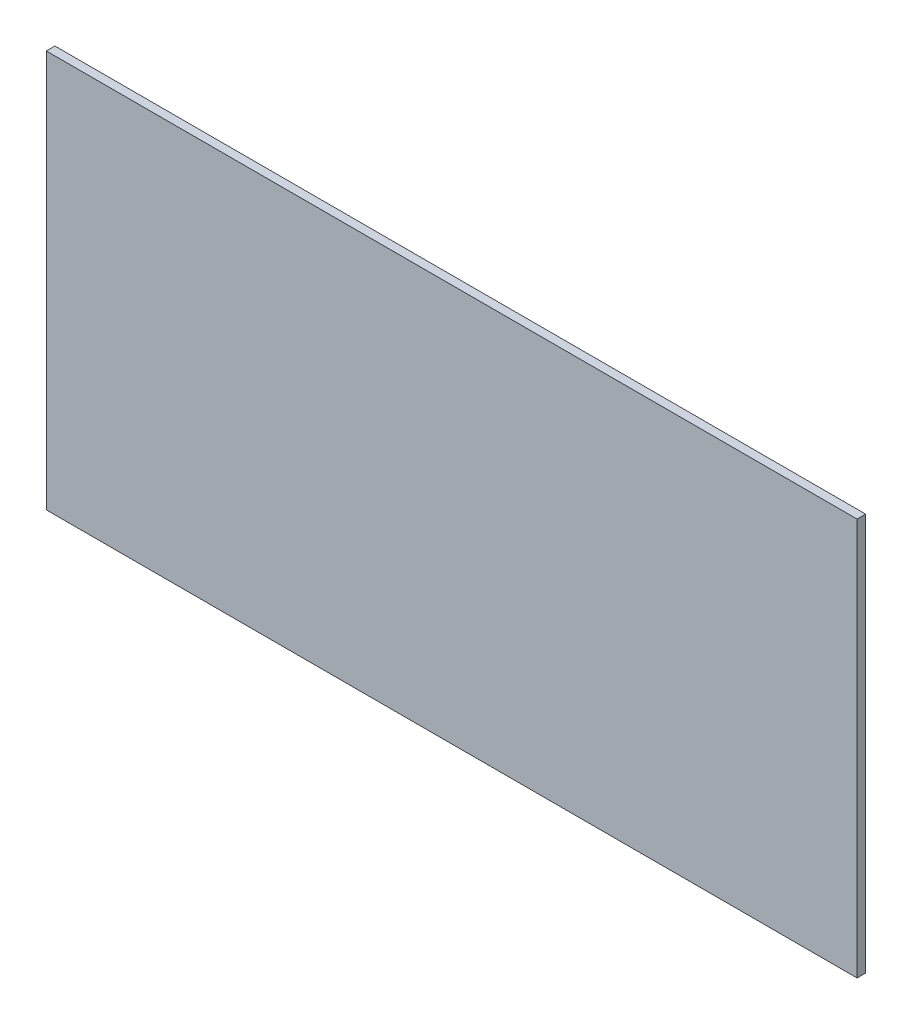
ISO-10303-21;
HEADER;
FILE_DESCRIPTION(('STEP AP214'),'2;1');
FILE_NAME('part.step','',(''),(''),'','','');
FILE_SCHEMA(('AUTOMOTIVE_DESIGN { 1 0 10303 214 1 1 1 1 }'));
ENDSEC;
DATA;
#1=APPLICATION_CONTEXT('core data for automotive mechanical design processes');
#2=APPLICATION_PROTOCOL_DEFINITION('international standard','automotive_design',2000,#1);
#3=PRODUCT_CONTEXT('',#1,'mechanical');
#4=PRODUCT('Part','Part','',(#3));
#5=PRODUCT_RELATED_PRODUCT_CATEGORY('part','',(#4));
#6=PRODUCT_DEFINITION_FORMATION('','',#4);
#7=PRODUCT_DEFINITION_CONTEXT('part definition',#1,'design');
#8=PRODUCT_DEFINITION('design','',#6,#7);
#9=PRODUCT_DEFINITION_SHAPE('','',#8);
#10=(LENGTH_UNIT() NAMED_UNIT(*) SI_UNIT(.MILLI.,.METRE.));
#11=(NAMED_UNIT(*) PLANE_ANGLE_UNIT() SI_UNIT($,.RADIAN.));
#12=(NAMED_UNIT(*) SI_UNIT($,.STERADIAN.) SOLID_ANGLE_UNIT());
#13=UNCERTAINTY_MEASURE_WITH_UNIT(LENGTH_MEASURE(1.E-05),#10,'distance_accuracy_value','');
#14=(GEOMETRIC_REPRESENTATION_CONTEXT(3) GLOBAL_UNCERTAINTY_ASSIGNED_CONTEXT((#13)) GLOBAL_UNIT_ASSIGNED_CONTEXT((#10,
#11,#12)) REPRESENTATION_CONTEXT('',''));
#15=CARTESIAN_POINT('',(0.,0.,0.));
#16=DIRECTION('',(0.,0.,1.));
#17=DIRECTION('',(1.,0.,0.));
#18=AXIS2_PLACEMENT_3D('',#15,#16,#17);
#19=CARTESIAN_POINT('',(-51.,-25.,1.08));
#20=DIRECTION('',(1.,0.,0.));
#21=DIRECTION('',(0.,0.,-1.));
#22=AXIS2_PLACEMENT_3D('',#19,#20,#21);
#23=PLANE('',#22);
#24=DIRECTION('',(0.,-1.,0.));
#25=VECTOR('',#24,1.);
#26=CARTESIAN_POINT('',(-51.,-25.,0.));
#27=LINE('',#26,#25);
#28=CARTESIAN_POINT('',(-51.,25.,0.));
#29=VERTEX_POINT('',#28);
#30=CARTESIAN_POINT('',(-51.,-25.,0.));
#31=VERTEX_POINT('',#30);
#32=EDGE_CURVE('E102',#29,#31,#27,.T.);
#33=ORIENTED_EDGE('',*,*,#32,.T.);
#34=DIRECTION('',(0.,0.,-1.));
#35=VECTOR('',#34,1.);
#36=CARTESIAN_POINT('',(-51.,-25.,1.08));
#37=LINE('',#36,#35);
#38=CARTESIAN_POINT('',(-51.,-25.,1.08));
#39=VERTEX_POINT('',#38);
#40=EDGE_CURVE('E11',#39,#31,#37,.T.);
#41=ORIENTED_EDGE('',*,*,#40,.F.);
#42=DIRECTION('',(0.,-1.,0.));
#43=VECTOR('',#42,1.);
#44=CARTESIAN_POINT('',(-51.,-25.,1.08));
#45=LINE('',#44,#43);
#46=CARTESIAN_POINT('',(-51.,25.,1.08));
#47=VERTEX_POINT('',#46);
#48=EDGE_CURVE('E90',#47,#39,#45,.T.);
#49=ORIENTED_EDGE('',*,*,#48,.F.);
#50=DIRECTION('',(0.,0.,-1.));
#51=VECTOR('',#50,1.);
#52=CARTESIAN_POINT('',(-51.,25.,1.08));
#53=LINE('',#52,#51);
#54=EDGE_CURVE('E98',#47,#29,#53,.T.);
#55=ORIENTED_EDGE('',*,*,#54,.T.);
#56=EDGE_LOOP('',(#33,#41,#49,#55));
#57=FACE_BOUND('',#56,.T.);
#58=ADVANCED_FACE('F39',(#57),#23,.F.);
#59=CARTESIAN_POINT('',(51.,-25.,1.08));
#60=DIRECTION('',(0.,1.,0.));
#61=DIRECTION('',(-1.,0.,0.));
#62=AXIS2_PLACEMENT_3D('',#59,#60,#61);
#63=PLANE('',#62);
#64=DIRECTION('',(1.,0.,0.));
#65=VECTOR('',#64,1.);
#66=CARTESIAN_POINT('',(51.,-25.,0.));
#67=LINE('',#66,#65);
#68=CARTESIAN_POINT('',(51.,-25.,0.));
#69=VERTEX_POINT('',#68);
#70=EDGE_CURVE('E94',#31,#69,#67,.T.);
#71=ORIENTED_EDGE('',*,*,#70,.T.);
#72=DIRECTION('',(0.,0.,-1.));
#73=VECTOR('',#72,1.);
#74=CARTESIAN_POINT('',(51.,-25.,1.08));
#75=LINE('',#74,#73);
#76=CARTESIAN_POINT('',(51.,-25.,1.08));
#77=VERTEX_POINT('',#76);
#78=EDGE_CURVE('E47',#77,#69,#75,.T.);
#79=ORIENTED_EDGE('',*,*,#78,.F.);
#80=DIRECTION('',(1.,0.,0.));
#81=VECTOR('',#80,1.);
#82=CARTESIAN_POINT('',(51.,-25.,1.08));
#83=LINE('',#82,#81);
#84=EDGE_CURVE('E85',#39,#77,#83,.T.);
#85=ORIENTED_EDGE('',*,*,#84,.F.);
#86=ORIENTED_EDGE('',*,*,#40,.T.);
#87=EDGE_LOOP('',(#71,#79,#85,#86));
#88=FACE_BOUND('',#87,.T.);
#89=ADVANCED_FACE('F93',(#88),#63,.F.);
#90=CARTESIAN_POINT('',(51.,-25.,1.08));
#91=DIRECTION('',(-1.,0.,0.));
#92=DIRECTION('',(0.,0.,1.));
#93=AXIS2_PLACEMENT_3D('',#90,#91,#92);
#94=PLANE('',#93);
#95=DIRECTION('',(0.,1.,0.));
#96=VECTOR('',#95,1.);
#97=CARTESIAN_POINT('',(51.,-25.,0.));
#98=LINE('',#97,#96);
#99=CARTESIAN_POINT('',(51.,25.,0.));
#100=VERTEX_POINT('',#99);
#101=EDGE_CURVE('E72',#69,#100,#98,.T.);
#102=ORIENTED_EDGE('',*,*,#101,.T.);
#103=DIRECTION('',(0.,0.,-1.));
#104=VECTOR('',#103,1.);
#105=CARTESIAN_POINT('',(51.,25.,1.08));
#106=LINE('',#105,#104);
#107=CARTESIAN_POINT('',(51.,25.,1.08));
#108=VERTEX_POINT('',#107);
#109=EDGE_CURVE('E95',#108,#100,#106,.T.);
#110=ORIENTED_EDGE('',*,*,#109,.F.);
#111=DIRECTION('',(0.,1.,0.));
#112=VECTOR('',#111,1.);
#113=CARTESIAN_POINT('',(51.,-25.,1.08));
#114=LINE('',#113,#112);
#115=EDGE_CURVE('E88',#77,#108,#114,.T.);
#116=ORIENTED_EDGE('',*,*,#115,.F.);
#117=ORIENTED_EDGE('',*,*,#78,.T.);
#118=EDGE_LOOP('',(#102,#110,#116,#117));
#119=FACE_BOUND('',#118,.T.);
#120=ADVANCED_FACE('F96',(#119),#94,.F.);
#121=CARTESIAN_POINT('',(51.,25.,1.08));
#122=DIRECTION('',(0.,-1.,0.));
#123=DIRECTION('',(1.,0.,0.));
#124=AXIS2_PLACEMENT_3D('',#121,#122,#123);
#125=PLANE('',#124);
#126=DIRECTION('',(-1.,0.,0.));
#127=VECTOR('',#126,1.);
#128=CARTESIAN_POINT('',(51.,25.,0.));
#129=LINE('',#128,#127);
#130=EDGE_CURVE('E78',#100,#29,#129,.T.);
#131=ORIENTED_EDGE('',*,*,#130,.T.);
#132=ORIENTED_EDGE('',*,*,#54,.F.);
#133=DIRECTION('',(-1.,0.,0.));
#134=VECTOR('',#133,1.);
#135=CARTESIAN_POINT('',(51.,25.,1.08));
#136=LINE('',#135,#134);
#137=EDGE_CURVE('E55',#108,#47,#136,.T.);
#138=ORIENTED_EDGE('',*,*,#137,.F.);
#139=ORIENTED_EDGE('',*,*,#109,.T.);
#140=EDGE_LOOP('',(#131,#132,#138,#139));
#141=FACE_BOUND('',#140,.T.);
#142=ADVANCED_FACE('F109',(#141),#125,.F.);
#143=CARTESIAN_POINT('',(0.,0.,1.08));
#144=DIRECTION('',(0.,0.,1.));
#145=DIRECTION('',(1.,0.,0.));
#146=AXIS2_PLACEMENT_3D('',#143,#144,#145);
#147=PLANE('',#146);
#148=ORIENTED_EDGE('',*,*,#48,.T.);
#149=ORIENTED_EDGE('',*,*,#84,.T.);
#150=ORIENTED_EDGE('',*,*,#115,.T.);
#151=ORIENTED_EDGE('',*,*,#137,.T.);
#152=EDGE_LOOP('',(#148,#149,#150,#151));
#153=FACE_BOUND('',#152,.T.);
#154=ADVANCED_FACE('F86',(#153),#147,.T.);
#155=CARTESIAN_POINT('',(0.,0.,0.));
#156=DIRECTION('',(0.,0.,1.));
#157=DIRECTION('',(1.,0.,0.));
#158=AXIS2_PLACEMENT_3D('',#155,#156,#157);
#159=PLANE('',#158);
#160=ORIENTED_EDGE('',*,*,#32,.F.);
#161=ORIENTED_EDGE('',*,*,#130,.F.);
#162=ORIENTED_EDGE('',*,*,#101,.F.);
#163=ORIENTED_EDGE('',*,*,#70,.F.);
#164=EDGE_LOOP('',(#160,#161,#162,#163));
#165=FACE_BOUND('',#164,.T.);
#166=ADVANCED_FACE('F112',(#165),#159,.F.);
#167=CLOSED_SHELL('',(#58,#89,#120,#142,#154,#166));
#168=MANIFOLD_SOLID_BREP('B2',#167);
#169=ADVANCED_BREP_SHAPE_REPRESENTATION('',(#18,#168),#14);
#170=SHAPE_DEFINITION_REPRESENTATION(#9,#169);
ENDSEC;
END-ISO-10303-21;
